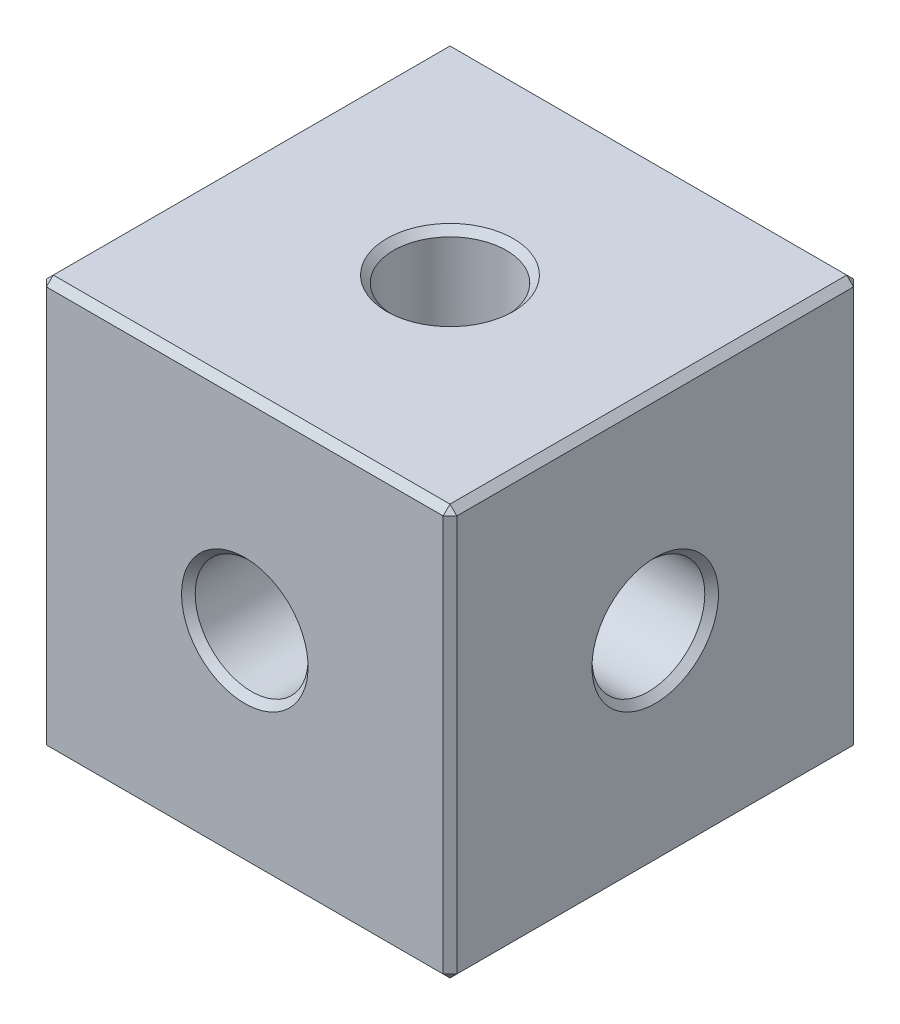
ISO-10303-21;
HEADER;
FILE_DESCRIPTION(('STEP AP214'),'2;1');
FILE_NAME('part.step','',(''),(''),'','','');
FILE_SCHEMA(('AUTOMOTIVE_DESIGN { 1 0 10303 214 1 1 1 1 }'));
ENDSEC;
DATA;
#1=APPLICATION_CONTEXT('core data for automotive mechanical design processes');
#2=APPLICATION_PROTOCOL_DEFINITION('international standard','automotive_design',2000,#1);
#3=PRODUCT_CONTEXT('',#1,'mechanical');
#4=PRODUCT('Part','Part','',(#3));
#5=PRODUCT_RELATED_PRODUCT_CATEGORY('part','',(#4));
#6=PRODUCT_DEFINITION_FORMATION('','',#4);
#7=PRODUCT_DEFINITION_CONTEXT('part definition',#1,'design');
#8=PRODUCT_DEFINITION('design','',#6,#7);
#9=PRODUCT_DEFINITION_SHAPE('','',#8);
#10=(LENGTH_UNIT() NAMED_UNIT(*) SI_UNIT(.MILLI.,.METRE.));
#11=(NAMED_UNIT(*) PLANE_ANGLE_UNIT() SI_UNIT($,.RADIAN.));
#12=(NAMED_UNIT(*) SI_UNIT($,.STERADIAN.) SOLID_ANGLE_UNIT());
#13=UNCERTAINTY_MEASURE_WITH_UNIT(LENGTH_MEASURE(1.E-05),#10,'distance_accuracy_value','');
#14=(GEOMETRIC_REPRESENTATION_CONTEXT(3) GLOBAL_UNCERTAINTY_ASSIGNED_CONTEXT((#13)) GLOBAL_UNIT_ASSIGNED_CONTEXT((#10,
#11,#12)) REPRESENTATION_CONTEXT('',''));
#15=CARTESIAN_POINT('',(0.,0.,0.));
#16=DIRECTION('',(0.,0.,1.));
#17=DIRECTION('',(1.,0.,0.));
#18=AXIS2_PLACEMENT_3D('',#15,#16,#17);
#19=CARTESIAN_POINT('',(0.,0.,6.));
#20=DIRECTION('',(0.,0.,1.));
#21=DIRECTION('',(1.,0.,0.));
#22=AXIS2_PLACEMENT_3D('',#19,#20,#21);
#23=CYLINDRICAL_SURFACE('',#22,1.65);
#24=CARTESIAN_POINT('',(0.,0.,5.8));
#25=DIRECTION('',(0.,0.,-1.));
#26=DIRECTION('',(-1.,0.,0.));
#27=AXIS2_PLACEMENT_3D('',#24,#25,#26);
#28=CIRCLE('',#27,1.65);
#29=CARTESIAN_POINT('',(-1.65,0.,5.8));
#30=VERTEX_POINT('',#29);
#31=EDGE_CURVE('E249',#30,#30,#28,.F.);
#32=ORIENTED_EDGE('',*,*,#31,.T.);
#33=EDGE_LOOP('',(#32));
#34=FACE_BOUND('',#33,.T.);
#35=CARTESIAN_POINT('',(0.,0.,0.));
#36=DIRECTION('',(0.,0.707106781186547,0.707106781186547));
#37=DIRECTION('',(0.,-0.707106781186547,0.707106781186547));
#38=AXIS2_PLACEMENT_3D('',#35,#36,#37);
#39=ELLIPSE('',#38,2.3334523779156,1.65);
#40=CARTESIAN_POINT('',(1.1667261889578,-1.1667261889578,1.1667261889578));
#41=VERTEX_POINT('',#40);
#42=CARTESIAN_POINT('',(-1.1667261889578,-1.1667261889578,1.1667261889578));
#43=VERTEX_POINT('',#42);
#44=EDGE_CURVE('E167',#41,#43,#39,.F.);
#45=ORIENTED_EDGE('',*,*,#44,.T.);
#46=CARTESIAN_POINT('',(0.,0.,0.));
#47=DIRECTION('',(0.707106781186548,0.,0.707106781186547));
#48=DIRECTION('',(-0.707106781186547,0.,0.707106781186547));
#49=AXIS2_PLACEMENT_3D('',#46,#47,#48);
#50=ELLIPSE('',#49,2.3334523779156,1.65);
#51=CARTESIAN_POINT('',(-1.1667261889578,1.1667261889578,1.1667261889578));
#52=VERTEX_POINT('',#51);
#53=EDGE_CURVE('E885',#43,#52,#50,.F.);
#54=ORIENTED_EDGE('',*,*,#53,.T.);
#55=CARTESIAN_POINT('',(0.,0.,0.));
#56=DIRECTION('',(0.,-0.707106781186547,0.707106781186547));
#57=DIRECTION('',(0.,0.707106781186547,0.707106781186547));
#58=AXIS2_PLACEMENT_3D('',#55,#56,#57);
#59=ELLIPSE('',#58,2.3334523779156,1.65);
#60=CARTESIAN_POINT('',(1.1667261889578,1.1667261889578,1.1667261889578));
#61=VERTEX_POINT('',#60);
#62=EDGE_CURVE('E184',#52,#61,#59,.F.);
#63=ORIENTED_EDGE('',*,*,#62,.T.);
#64=CARTESIAN_POINT('',(0.,0.,0.));
#65=DIRECTION('',(-0.707106781186547,0.,0.707106781186547));
#66=DIRECTION('',(0.707106781186548,0.,0.707106781186547));
#67=AXIS2_PLACEMENT_3D('',#64,#65,#66);
#68=ELLIPSE('',#67,2.3334523779156,1.65);
#69=EDGE_CURVE('E161',#61,#41,#68,.F.);
#70=ORIENTED_EDGE('',*,*,#69,.T.);
#71=EDGE_LOOP('',(#45,#54,#63,#70));
#72=FACE_BOUND('',#71,.T.);
#73=ADVANCED_FACE('F41',(#34,#72),#23,.F.);
#74=CARTESIAN_POINT('',(6.,6.,-6.));
#75=DIRECTION('',(-1.,0.,0.));
#76=DIRECTION('',(0.,0.,1.));
#77=AXIS2_PLACEMENT_3D('',#74,#75,#76);
#78=PLANE('',#77);
#79=CARTESIAN_POINT('',(6.,0.,0.));
#80=DIRECTION('',(-1.,0.,0.));
#81=DIRECTION('',(0.,0.,1.));
#82=AXIS2_PLACEMENT_3D('',#79,#80,#81);
#83=CIRCLE('',#82,1.85);
#84=CARTESIAN_POINT('',(6.,0.,1.85));
#85=VERTEX_POINT('',#84);
#86=EDGE_CURVE('E246',#85,#85,#83,.T.);
#87=ORIENTED_EDGE('',*,*,#86,.T.);
#88=EDGE_LOOP('',(#87));
#89=FACE_BOUND('',#88,.T.);
#90=DIRECTION('',(0.,0.,-1.));
#91=VECTOR('',#90,1.);
#92=CARTESIAN_POINT('',(6.,-5.8,-6.));
#93=LINE('',#92,#91);
#94=CARTESIAN_POINT('',(6.,-5.8,5.8));
#95=VERTEX_POINT('',#94);
#96=CARTESIAN_POINT('',(6.,-5.8,-5.8));
#97=VERTEX_POINT('',#96);
#98=EDGE_CURVE('E241',#95,#97,#93,.T.);
#99=ORIENTED_EDGE('',*,*,#98,.T.);
#100=DIRECTION('',(0.,1.,0.));
#101=VECTOR('',#100,1.);
#102=CARTESIAN_POINT('',(6.,6.,-5.8));
#103=LINE('',#102,#101);
#104=CARTESIAN_POINT('',(6.,5.8,-5.8));
#105=VERTEX_POINT('',#104);
#106=EDGE_CURVE('E243',#97,#105,#103,.T.);
#107=ORIENTED_EDGE('',*,*,#106,.T.);
#108=DIRECTION('',(0.,0.,1.));
#109=VECTOR('',#108,1.);
#110=CARTESIAN_POINT('',(6.,5.8,6.));
#111=LINE('',#110,#109);
#112=CARTESIAN_POINT('',(6.,5.8,5.8));
#113=VERTEX_POINT('',#112);
#114=EDGE_CURVE('E237',#105,#113,#111,.T.);
#115=ORIENTED_EDGE('',*,*,#114,.T.);
#116=DIRECTION('',(0.,-1.,0.));
#117=VECTOR('',#116,1.);
#118=CARTESIAN_POINT('',(6.,6.,5.8));
#119=LINE('',#118,#117);
#120=EDGE_CURVE('E239',#113,#95,#119,.T.);
#121=ORIENTED_EDGE('',*,*,#120,.T.);
#122=EDGE_LOOP('',(#99,#107,#115,#121));
#123=FACE_BOUND('',#122,.T.);
#124=ADVANCED_FACE('F350',(#89,#123),#78,.F.);
#125=CARTESIAN_POINT('',(-6.,6.,-6.));
#126=DIRECTION('',(0.,0.,1.));
#127=DIRECTION('',(1.,0.,0.));
#128=AXIS2_PLACEMENT_3D('',#125,#126,#127);
#129=PLANE('',#128);
#130=CARTESIAN_POINT('',(0.,0.,-6.));
#131=DIRECTION('',(0.,0.,1.));
#132=DIRECTION('',(1.,0.,0.));
#133=AXIS2_PLACEMENT_3D('',#130,#131,#132);
#134=CIRCLE('',#133,1.85);
#135=CARTESIAN_POINT('',(1.85,0.,-6.));
#136=VERTEX_POINT('',#135);
#137=EDGE_CURVE('E228',#136,#136,#134,.T.);
#138=ORIENTED_EDGE('',*,*,#137,.T.);
#139=EDGE_LOOP('',(#138));
#140=FACE_BOUND('',#139,.T.);
#141=DIRECTION('',(-1.,0.,0.));
#142=VECTOR('',#141,1.);
#143=CARTESIAN_POINT('',(-6.,-5.8,-6.));
#144=LINE('',#143,#142);
#145=CARTESIAN_POINT('',(5.8,-5.8,-6.));
#146=VERTEX_POINT('',#145);
#147=CARTESIAN_POINT('',(-5.8,-5.8,-6.));
#148=VERTEX_POINT('',#147);
#149=EDGE_CURVE('E223',#146,#148,#144,.T.);
#150=ORIENTED_EDGE('',*,*,#149,.T.);
#151=DIRECTION('',(0.,1.,0.));
#152=VECTOR('',#151,1.);
#153=CARTESIAN_POINT('',(-5.8,6.,-6.));
#154=LINE('',#153,#152);
#155=CARTESIAN_POINT('',(-5.8,5.8,-6.));
#156=VERTEX_POINT('',#155);
#157=EDGE_CURVE('E225',#148,#156,#154,.T.);
#158=ORIENTED_EDGE('',*,*,#157,.T.);
#159=DIRECTION('',(1.,0.,0.));
#160=VECTOR('',#159,1.);
#161=CARTESIAN_POINT('',(6.,5.8,-6.));
#162=LINE('',#161,#160);
#163=CARTESIAN_POINT('',(5.8,5.8,-6.));
#164=VERTEX_POINT('',#163);
#165=EDGE_CURVE('E219',#156,#164,#162,.T.);
#166=ORIENTED_EDGE('',*,*,#165,.T.);
#167=DIRECTION('',(0.,-1.,0.));
#168=VECTOR('',#167,1.);
#169=CARTESIAN_POINT('',(5.8,6.,-6.));
#170=LINE('',#169,#168);
#171=EDGE_CURVE('E221',#164,#146,#170,.T.);
#172=ORIENTED_EDGE('',*,*,#171,.T.);
#173=EDGE_LOOP('',(#150,#158,#166,#172));
#174=FACE_BOUND('',#173,.T.);
#175=ADVANCED_FACE('F371',(#140,#174),#129,.F.);
#176=CARTESIAN_POINT('',(-6.,6.,-6.));
#177=DIRECTION('',(1.,0.,0.));
#178=DIRECTION('',(0.,0.,-1.));
#179=AXIS2_PLACEMENT_3D('',#176,#177,#178);
#180=PLANE('',#179);
#181=CARTESIAN_POINT('',(-6.,0.,0.));
#182=DIRECTION('',(1.,0.,0.));
#183=DIRECTION('',(0.,0.,-1.));
#184=AXIS2_PLACEMENT_3D('',#181,#182,#183);
#185=CIRCLE('',#184,1.85);
#186=CARTESIAN_POINT('',(-6.,0.,-1.85));
#187=VERTEX_POINT('',#186);
#188=EDGE_CURVE('E213',#187,#187,#185,.T.);
#189=ORIENTED_EDGE('',*,*,#188,.T.);
#190=EDGE_LOOP('',(#189));
#191=FACE_BOUND('',#190,.T.);
#192=DIRECTION('',(0.,-1.,0.));
#193=VECTOR('',#192,1.);
#194=CARTESIAN_POINT('',(-6.,6.,-5.8));
#195=LINE('',#194,#193);
#196=CARTESIAN_POINT('',(-6.,5.8,-5.8));
#197=VERTEX_POINT('',#196);
#198=CARTESIAN_POINT('',(-6.,-5.8,-5.8));
#199=VERTEX_POINT('',#198);
#200=EDGE_CURVE('E208',#197,#199,#195,.T.);
#201=ORIENTED_EDGE('',*,*,#200,.T.);
#202=DIRECTION('',(0.,0.,1.));
#203=VECTOR('',#202,1.);
#204=CARTESIAN_POINT('',(-6.,-5.8,-6.));
#205=LINE('',#204,#203);
#206=CARTESIAN_POINT('',(-6.,-5.8,5.8));
#207=VERTEX_POINT('',#206);
#208=EDGE_CURVE('E210',#199,#207,#205,.T.);
#209=ORIENTED_EDGE('',*,*,#208,.T.);
#210=DIRECTION('',(0.,1.,0.));
#211=VECTOR('',#210,1.);
#212=CARTESIAN_POINT('',(-6.,6.,5.8));
#213=LINE('',#212,#211);
#214=CARTESIAN_POINT('',(-6.,5.8,5.8));
#215=VERTEX_POINT('',#214);
#216=EDGE_CURVE('E206',#207,#215,#213,.T.);
#217=ORIENTED_EDGE('',*,*,#216,.T.);
#218=DIRECTION('',(0.,0.,-1.));
#219=VECTOR('',#218,1.);
#220=CARTESIAN_POINT('',(-6.,5.8,-6.));
#221=LINE('',#220,#219);
#222=EDGE_CURVE('E204',#215,#197,#221,.T.);
#223=ORIENTED_EDGE('',*,*,#222,.T.);
#224=EDGE_LOOP('',(#201,#209,#217,#223));
#225=FACE_BOUND('',#224,.T.);
#226=ADVANCED_FACE('F432',(#191,#225),#180,.F.);
#227=CARTESIAN_POINT('',(-6.,6.,6.));
#228=DIRECTION('',(0.,0.,-1.));
#229=DIRECTION('',(-1.,0.,0.));
#230=AXIS2_PLACEMENT_3D('',#227,#228,#229);
#231=PLANE('',#230);
#232=CARTESIAN_POINT('',(0.,0.,6.));
#233=DIRECTION('',(0.,0.,-1.));
#234=DIRECTION('',(-1.,0.,0.));
#235=AXIS2_PLACEMENT_3D('',#232,#233,#234);
#236=CIRCLE('',#235,1.85);
#237=CARTESIAN_POINT('',(-1.85,0.,6.));
#238=VERTEX_POINT('',#237);
#239=EDGE_CURVE('E261',#238,#238,#236,.T.);
#240=ORIENTED_EDGE('',*,*,#239,.T.);
#241=EDGE_LOOP('',(#240));
#242=FACE_BOUND('',#241,.T.);
#243=DIRECTION('',(-1.,0.,0.));
#244=VECTOR('',#243,1.);
#245=CARTESIAN_POINT('',(-6.,5.8,6.));
#246=LINE('',#245,#244);
#247=CARTESIAN_POINT('',(5.8,5.8,6.));
#248=VERTEX_POINT('',#247);
#249=CARTESIAN_POINT('',(-5.8,5.8,6.));
#250=VERTEX_POINT('',#249);
#251=EDGE_CURVE('E252',#248,#250,#246,.T.);
#252=ORIENTED_EDGE('',*,*,#251,.T.);
#253=DIRECTION('',(0.,-1.,0.));
#254=VECTOR('',#253,1.);
#255=CARTESIAN_POINT('',(-5.8,6.,6.));
#256=LINE('',#255,#254);
#257=CARTESIAN_POINT('',(-5.8,-5.8,6.));
#258=VERTEX_POINT('',#257);
#259=EDGE_CURVE('E258',#250,#258,#256,.T.);
#260=ORIENTED_EDGE('',*,*,#259,.T.);
#261=DIRECTION('',(1.,0.,0.));
#262=VECTOR('',#261,1.);
#263=CARTESIAN_POINT('',(-6.,-5.8,6.));
#264=LINE('',#263,#262);
#265=CARTESIAN_POINT('',(5.8,-5.8,6.));
#266=VERTEX_POINT('',#265);
#267=EDGE_CURVE('E256',#258,#266,#264,.T.);
#268=ORIENTED_EDGE('',*,*,#267,.T.);
#269=DIRECTION('',(0.,1.,0.));
#270=VECTOR('',#269,1.);
#271=CARTESIAN_POINT('',(5.8,6.,6.));
#272=LINE('',#271,#270);
#273=EDGE_CURVE('E254',#266,#248,#272,.T.);
#274=ORIENTED_EDGE('',*,*,#273,.T.);
#275=EDGE_LOOP('',(#252,#260,#268,#274));
#276=FACE_BOUND('',#275,.T.);
#277=ADVANCED_FACE('F437',(#242,#276),#231,.F.);
#278=CARTESIAN_POINT('',(0.,6.,0.));
#279=DIRECTION('',(0.,1.,0.));
#280=DIRECTION('',(0.,0.,1.));
#281=AXIS2_PLACEMENT_3D('',#278,#279,#280);
#282=PLANE('',#281);
#283=DIRECTION('',(0.,0.,1.));
#284=VECTOR('',#283,1.);
#285=CARTESIAN_POINT('',(-5.8,6.,6.));
#286=LINE('',#285,#284);
#287=CARTESIAN_POINT('',(-5.8,6.,-5.8));
#288=VERTEX_POINT('',#287);
#289=CARTESIAN_POINT('',(-5.8,6.,5.8));
#290=VERTEX_POINT('',#289);
#291=EDGE_CURVE('E59',#288,#290,#286,.T.);
#292=ORIENTED_EDGE('',*,*,#291,.T.);
#293=DIRECTION('',(1.,0.,0.));
#294=VECTOR('',#293,1.);
#295=CARTESIAN_POINT('',(6.,6.,5.8));
#296=LINE('',#295,#294);
#297=CARTESIAN_POINT('',(5.8,6.,5.8));
#298=VERTEX_POINT('',#297);
#299=EDGE_CURVE('E51',#290,#298,#296,.T.);
#300=ORIENTED_EDGE('',*,*,#299,.T.);
#301=DIRECTION('',(0.,0.,-1.));
#302=VECTOR('',#301,1.);
#303=CARTESIAN_POINT('',(5.8,6.,-6.));
#304=LINE('',#303,#302);
#305=CARTESIAN_POINT('',(5.8,6.,-5.8));
#306=VERTEX_POINT('',#305);
#307=EDGE_CURVE('E267',#298,#306,#304,.T.);
#308=ORIENTED_EDGE('',*,*,#307,.T.);
#309=DIRECTION('',(-1.,0.,0.));
#310=VECTOR('',#309,1.);
#311=CARTESIAN_POINT('',(-6.,6.,-5.8));
#312=LINE('',#311,#310);
#313=EDGE_CURVE('E64',#306,#288,#312,.T.);
#314=ORIENTED_EDGE('',*,*,#313,.T.);
#315=EDGE_LOOP('',(#292,#300,#308,#314));
#316=FACE_BOUND('',#315,.T.);
#317=CARTESIAN_POINT('',(0.,6.,0.));
#318=DIRECTION('',(0.,1.,0.));
#319=DIRECTION('',(0.,0.,1.));
#320=AXIS2_PLACEMENT_3D('',#317,#318,#319);
#321=CIRCLE('',#320,1.85);
#322=CARTESIAN_POINT('',(0.,6.,1.85));
#323=VERTEX_POINT('',#322);
#324=EDGE_CURVE('E264',#323,#323,#321,.F.);
#325=ORIENTED_EDGE('',*,*,#324,.T.);
#326=EDGE_LOOP('',(#325));
#327=FACE_BOUND('',#326,.T.);
#328=ADVANCED_FACE('F418',(#316,#327),#282,.T.);
#329=CARTESIAN_POINT('',(0.,-6.,0.));
#330=DIRECTION('',(0.,1.,0.));
#331=DIRECTION('',(0.,0.,1.));
#332=AXIS2_PLACEMENT_3D('',#329,#330,#331);
#333=PLANE('',#332);
#334=CARTESIAN_POINT('',(0.,-6.,0.));
#335=DIRECTION('',(0.,1.,0.));
#336=DIRECTION('',(0.,0.,1.));
#337=AXIS2_PLACEMENT_3D('',#334,#335,#336);
#338=CIRCLE('',#337,1.85);
#339=CARTESIAN_POINT('',(0.,-6.,1.85));
#340=VERTEX_POINT('',#339);
#341=EDGE_CURVE('E198',#340,#340,#338,.T.);
#342=ORIENTED_EDGE('',*,*,#341,.T.);
#343=EDGE_LOOP('',(#342));
#344=FACE_BOUND('',#343,.T.);
#345=DIRECTION('',(-1.,0.,0.));
#346=VECTOR('',#345,1.);
#347=CARTESIAN_POINT('',(0.,-6.,5.8));
#348=LINE('',#347,#346);
#349=CARTESIAN_POINT('',(5.8,-6.,5.8));
#350=VERTEX_POINT('',#349);
#351=CARTESIAN_POINT('',(-5.8,-6.,5.8));
#352=VERTEX_POINT('',#351);
#353=EDGE_CURVE('E189',#350,#352,#348,.T.);
#354=ORIENTED_EDGE('',*,*,#353,.T.);
#355=DIRECTION('',(0.,0.,-1.));
#356=VECTOR('',#355,1.);
#357=CARTESIAN_POINT('',(-5.8,-6.,0.));
#358=LINE('',#357,#356);
#359=CARTESIAN_POINT('',(-5.8,-6.,-5.8));
#360=VERTEX_POINT('',#359);
#361=EDGE_CURVE('E195',#352,#360,#358,.T.);
#362=ORIENTED_EDGE('',*,*,#361,.T.);
#363=DIRECTION('',(1.,0.,0.));
#364=VECTOR('',#363,1.);
#365=CARTESIAN_POINT('',(0.,-6.,-5.8));
#366=LINE('',#365,#364);
#367=CARTESIAN_POINT('',(5.8,-6.,-5.8));
#368=VERTEX_POINT('',#367);
#369=EDGE_CURVE('E193',#360,#368,#366,.T.);
#370=ORIENTED_EDGE('',*,*,#369,.T.);
#371=DIRECTION('',(0.,0.,1.));
#372=VECTOR('',#371,1.);
#373=CARTESIAN_POINT('',(5.8,-6.,0.));
#374=LINE('',#373,#372);
#375=EDGE_CURVE('E191',#368,#350,#374,.T.);
#376=ORIENTED_EDGE('',*,*,#375,.T.);
#377=EDGE_LOOP('',(#354,#362,#370,#376));
#378=FACE_BOUND('',#377,.T.);
#379=ADVANCED_FACE('F410',(#344,#378),#333,.F.);
#380=CARTESIAN_POINT('',(0.,0.,-5.8));
#381=DIRECTION('',(0.,0.,1.));
#382=DIRECTION('',(1.,0.,0.));
#383=AXIS2_PLACEMENT_3D('',#380,#381,#382);
#384=CIRCLE('',#383,1.65);
#385=CARTESIAN_POINT('',(1.65,0.,-5.8));
#386=VERTEX_POINT('',#385);
#387=EDGE_CURVE('E231',#386,#386,#384,.F.);
#388=ORIENTED_EDGE('',*,*,#387,.T.);
#389=EDGE_LOOP('',(#388));
#390=FACE_BOUND('',#389,.T.);
#391=CARTESIAN_POINT('',(0.,0.,0.));
#392=DIRECTION('',(0.,-0.707106781186547,0.707106781186547));
#393=DIRECTION('',(0.,0.707106781186547,0.707106781186547));
#394=AXIS2_PLACEMENT_3D('',#391,#392,#393);
#395=ELLIPSE('',#394,2.3334523779156,1.65);
#396=CARTESIAN_POINT('',(-1.1667261889578,-1.1667261889578,-1.1667261889578));
#397=VERTEX_POINT('',#396);
#398=CARTESIAN_POINT('',(1.1667261889578,-1.1667261889578,-1.1667261889578));
#399=VERTEX_POINT('',#398);
#400=EDGE_CURVE('E176',#397,#399,#395,.T.);
#401=ORIENTED_EDGE('',*,*,#400,.T.);
#402=CARTESIAN_POINT('',(0.,0.,0.));
#403=DIRECTION('',(0.707106781186548,0.,0.707106781186547));
#404=DIRECTION('',(-0.707106781186547,0.,0.707106781186547));
#405=AXIS2_PLACEMENT_3D('',#402,#403,#404);
#406=ELLIPSE('',#405,2.3334523779156,1.65);
#407=CARTESIAN_POINT('',(1.1667261889578,1.1667261889578,-1.1667261889578));
#408=VERTEX_POINT('',#407);
#409=EDGE_CURVE('E158',#399,#408,#406,.T.);
#410=ORIENTED_EDGE('',*,*,#409,.T.);
#411=CARTESIAN_POINT('',(0.,0.,0.));
#412=DIRECTION('',(0.,0.707106781186547,0.707106781186547));
#413=DIRECTION('',(0.,-0.707106781186547,0.707106781186547));
#414=AXIS2_PLACEMENT_3D('',#411,#412,#413);
#415=ELLIPSE('',#414,2.3334523779156,1.65);
#416=CARTESIAN_POINT('',(-1.1667261889578,1.1667261889578,-1.1667261889578));
#417=VERTEX_POINT('',#416);
#418=EDGE_CURVE('E174',#408,#417,#415,.T.);
#419=ORIENTED_EDGE('',*,*,#418,.T.);
#420=CARTESIAN_POINT('',(0.,0.,0.));
#421=DIRECTION('',(-0.707106781186547,0.,0.707106781186547));
#422=DIRECTION('',(0.707106781186548,0.,0.707106781186547));
#423=AXIS2_PLACEMENT_3D('',#420,#421,#422);
#424=ELLIPSE('',#423,2.3334523779156,1.65);
#425=EDGE_CURVE('E886',#417,#397,#424,.T.);
#426=ORIENTED_EDGE('',*,*,#425,.T.);
#427=EDGE_LOOP('',(#401,#410,#419,#426));
#428=FACE_BOUND('',#427,.T.);
#429=ADVANCED_FACE('F172',(#390,#428),#23,.F.);
#430=CARTESIAN_POINT('',(0.,6.,0.));
#431=DIRECTION('',(0.,1.,0.));
#432=DIRECTION('',(0.,0.,1.));
#433=AXIS2_PLACEMENT_3D('',#430,#431,#432);
#434=CYLINDRICAL_SURFACE('',#433,1.65);
#435=CARTESIAN_POINT('',(0.,5.8,0.));
#436=DIRECTION('',(0.,1.,0.));
#437=DIRECTION('',(0.,0.,1.));
#438=AXIS2_PLACEMENT_3D('',#435,#436,#437);
#439=CIRCLE('',#438,1.65);
#440=CARTESIAN_POINT('',(0.,5.8,1.65));
#441=VERTEX_POINT('',#440);
#442=EDGE_CURVE('E11',#441,#441,#439,.T.);
#443=ORIENTED_EDGE('',*,*,#442,.T.);
#444=EDGE_LOOP('',(#443));
#445=FACE_BOUND('',#444,.T.);
#446=ORIENTED_EDGE('',*,*,#62,.F.);
#447=CARTESIAN_POINT('',(0.,0.,0.));
#448=DIRECTION('',(0.707106781186547,0.707106781186547,0.));
#449=DIRECTION('',(-0.707106781186547,0.707106781186547,0.));
#450=AXIS2_PLACEMENT_3D('',#447,#448,#449);
#451=ELLIPSE('',#450,2.3334523779156,1.65);
#452=EDGE_CURVE('E166',#52,#417,#451,.F.);
#453=ORIENTED_EDGE('',*,*,#452,.T.);
#454=ORIENTED_EDGE('',*,*,#418,.F.);
#455=CARTESIAN_POINT('',(0.,0.,0.));
#456=DIRECTION('',(-0.707106781186547,0.707106781186547,0.));
#457=DIRECTION('',(0.707106781186547,0.707106781186547,0.));
#458=AXIS2_PLACEMENT_3D('',#455,#456,#457);
#459=ELLIPSE('',#458,2.3334523779156,1.65);
#460=EDGE_CURVE('E155',#408,#61,#459,.F.);
#461=ORIENTED_EDGE('',*,*,#460,.T.);
#462=EDGE_LOOP('',(#446,#453,#454,#461));
#463=FACE_BOUND('',#462,.T.);
#464=ADVANCED_FACE('F180',(#445,#463),#434,.F.);
#465=CARTESIAN_POINT('',(0.,-5.8,0.));
#466=DIRECTION('',(0.,1.,0.));
#467=DIRECTION('',(0.,0.,1.));
#468=AXIS2_PLACEMENT_3D('',#465,#466,#467);
#469=CIRCLE('',#468,1.65);
#470=CARTESIAN_POINT('',(0.,-5.8,1.65));
#471=VERTEX_POINT('',#470);
#472=EDGE_CURVE('E201',#471,#471,#469,.F.);
#473=ORIENTED_EDGE('',*,*,#472,.T.);
#474=EDGE_LOOP('',(#473));
#475=FACE_BOUND('',#474,.T.);
#476=ORIENTED_EDGE('',*,*,#44,.F.);
#477=CARTESIAN_POINT('',(0.,0.,0.));
#478=DIRECTION('',(0.707106781186547,0.707106781186547,0.));
#479=DIRECTION('',(-0.707106781186547,0.707106781186547,0.));
#480=AXIS2_PLACEMENT_3D('',#477,#478,#479);
#481=ELLIPSE('',#480,2.3334523779156,1.65);
#482=EDGE_CURVE('E177',#41,#399,#481,.T.);
#483=ORIENTED_EDGE('',*,*,#482,.T.);
#484=ORIENTED_EDGE('',*,*,#400,.F.);
#485=CARTESIAN_POINT('',(0.,0.,0.));
#486=DIRECTION('',(-0.707106781186547,0.707106781186547,0.));
#487=DIRECTION('',(0.707106781186547,0.707106781186547,0.));
#488=AXIS2_PLACEMENT_3D('',#485,#486,#487);
#489=ELLIPSE('',#488,2.3334523779156,1.65);
#490=EDGE_CURVE('E883',#397,#43,#489,.T.);
#491=ORIENTED_EDGE('',*,*,#490,.T.);
#492=EDGE_LOOP('',(#476,#483,#484,#491));
#493=FACE_BOUND('',#492,.T.);
#494=ADVANCED_FACE('F416',(#475,#493),#434,.F.);
#495=CARTESIAN_POINT('',(6.,0.,0.));
#496=DIRECTION('',(1.,0.,0.));
#497=DIRECTION('',(0.,0.,-1.));
#498=AXIS2_PLACEMENT_3D('',#495,#496,#497);
#499=CYLINDRICAL_SURFACE('',#498,1.65);
#500=CARTESIAN_POINT('',(5.8,0.,0.));
#501=DIRECTION('',(-1.,0.,0.));
#502=DIRECTION('',(0.,0.,1.));
#503=AXIS2_PLACEMENT_3D('',#500,#501,#502);
#504=CIRCLE('',#503,1.65);
#505=CARTESIAN_POINT('',(5.8,0.,1.65));
#506=VERTEX_POINT('',#505);
#507=EDGE_CURVE('E234',#506,#506,#504,.F.);
#508=ORIENTED_EDGE('',*,*,#507,.T.);
#509=EDGE_LOOP('',(#508));
#510=FACE_BOUND('',#509,.T.);
#511=ORIENTED_EDGE('',*,*,#460,.F.);
#512=ORIENTED_EDGE('',*,*,#409,.F.);
#513=ORIENTED_EDGE('',*,*,#482,.F.);
#514=ORIENTED_EDGE('',*,*,#69,.F.);
#515=EDGE_LOOP('',(#511,#512,#513,#514));
#516=FACE_BOUND('',#515,.T.);
#517=ADVANCED_FACE('F157',(#510,#516),#499,.F.);
#518=CARTESIAN_POINT('',(-5.8,0.,0.));
#519=DIRECTION('',(1.,0.,0.));
#520=DIRECTION('',(0.,0.,-1.));
#521=AXIS2_PLACEMENT_3D('',#518,#519,#520);
#522=CIRCLE('',#521,1.65);
#523=CARTESIAN_POINT('',(-5.8,0.,-1.65));
#524=VERTEX_POINT('',#523);
#525=EDGE_CURVE('E216',#524,#524,#522,.F.);
#526=ORIENTED_EDGE('',*,*,#525,.T.);
#527=EDGE_LOOP('',(#526));
#528=FACE_BOUND('',#527,.T.);
#529=ORIENTED_EDGE('',*,*,#490,.F.);
#530=ORIENTED_EDGE('',*,*,#425,.F.);
#531=ORIENTED_EDGE('',*,*,#452,.F.);
#532=ORIENTED_EDGE('',*,*,#53,.F.);
#533=EDGE_LOOP('',(#529,#530,#531,#532));
#534=FACE_BOUND('',#533,.T.);
#535=ADVANCED_FACE('F449',(#528,#534),#499,.F.);
#536=CARTESIAN_POINT('',(0.,-6.,0.));
#537=DIRECTION('',(0.,-1.,0.));
#538=DIRECTION('',(0.,0.,-1.));
#539=AXIS2_PLACEMENT_3D('',#536,#537,#538);
#540=CONICAL_SURFACE('',#539,1.85,0.785398163397446);
#541=ORIENTED_EDGE('',*,*,#472,.F.);
#542=EDGE_LOOP('',(#541));
#543=FACE_BOUND('',#542,.T.);
#544=ORIENTED_EDGE('',*,*,#341,.F.);
#545=EDGE_LOOP('',(#544));
#546=FACE_BOUND('',#545,.T.);
#547=ADVANCED_FACE('F443',(#543,#546),#540,.F.);
#548=CARTESIAN_POINT('',(-6.,0.,0.));
#549=DIRECTION('',(-1.,0.,0.));
#550=DIRECTION('',(0.,0.,1.));
#551=AXIS2_PLACEMENT_3D('',#548,#549,#550);
#552=CONICAL_SURFACE('',#551,1.85,0.785398163397446);
#553=ORIENTED_EDGE('',*,*,#525,.F.);
#554=EDGE_LOOP('',(#553));
#555=FACE_BOUND('',#554,.T.);
#556=ORIENTED_EDGE('',*,*,#188,.F.);
#557=EDGE_LOOP('',(#556));
#558=FACE_BOUND('',#557,.T.);
#559=ADVANCED_FACE('F427',(#555,#558),#552,.F.);
#560=CARTESIAN_POINT('',(0.,0.,-6.));
#561=DIRECTION('',(0.,0.,-1.));
#562=DIRECTION('',(-1.,0.,0.));
#563=AXIS2_PLACEMENT_3D('',#560,#561,#562);
#564=CONICAL_SURFACE('',#563,1.85,0.785398163397446);
#565=ORIENTED_EDGE('',*,*,#387,.F.);
#566=EDGE_LOOP('',(#565));
#567=FACE_BOUND('',#566,.T.);
#568=ORIENTED_EDGE('',*,*,#137,.F.);
#569=EDGE_LOOP('',(#568));
#570=FACE_BOUND('',#569,.T.);
#571=ADVANCED_FACE('F423',(#567,#570),#564,.F.);
#572=CARTESIAN_POINT('',(5.8,0.,0.));
#573=DIRECTION('',(1.,0.,0.));
#574=DIRECTION('',(0.,0.,-1.));
#575=AXIS2_PLACEMENT_3D('',#572,#573,#574);
#576=CONICAL_SURFACE('',#575,1.65,0.785398163397456);
#577=ORIENTED_EDGE('',*,*,#86,.F.);
#578=EDGE_LOOP('',(#577));
#579=FACE_BOUND('',#578,.T.);
#580=ORIENTED_EDGE('',*,*,#507,.F.);
#581=EDGE_LOOP('',(#580));
#582=FACE_BOUND('',#581,.T.);
#583=ADVANCED_FACE('F426',(#579,#582),#576,.F.);
#584=CARTESIAN_POINT('',(0.,0.,5.8));
#585=DIRECTION('',(0.,0.,1.));
#586=DIRECTION('',(1.,0.,0.));
#587=AXIS2_PLACEMENT_3D('',#584,#585,#586);
#588=CONICAL_SURFACE('',#587,1.65,0.785398163397448);
#589=ORIENTED_EDGE('',*,*,#239,.F.);
#590=EDGE_LOOP('',(#589));
#591=FACE_BOUND('',#590,.T.);
#592=ORIENTED_EDGE('',*,*,#31,.F.);
#593=EDGE_LOOP('',(#592));
#594=FACE_BOUND('',#593,.T.);
#595=ADVANCED_FACE('F465',(#591,#594),#588,.F.);
#596=CARTESIAN_POINT('',(5.8,6.,0.));
#597=DIRECTION('',(0.707106781186551,0.707106781186544,0.));
#598=DIRECTION('',(0.,0.,1.));
#599=AXIS2_PLACEMENT_3D('',#596,#597,#598);
#600=PLANE('',#599);
#601=DIRECTION('',(0.707106781186544,-0.70710678118655,0.));
#602=VECTOR('',#601,1.);
#603=CARTESIAN_POINT('',(6.,5.8,-5.8));
#604=LINE('',#603,#602);
#605=EDGE_CURVE('E46',#306,#105,#604,.T.);
#606=ORIENTED_EDGE('',*,*,#605,.F.);
#607=ORIENTED_EDGE('',*,*,#307,.F.);
#608=DIRECTION('',(-0.707106781186544,0.707106781186551,0.));
#609=VECTOR('',#608,1.);
#610=CARTESIAN_POINT('',(5.9,5.9,5.8));
#611=LINE('',#610,#609);
#612=EDGE_CURVE('E331',#113,#298,#611,.T.);
#613=ORIENTED_EDGE('',*,*,#612,.F.);
#614=ORIENTED_EDGE('',*,*,#114,.F.);
#615=EDGE_LOOP('',(#606,#607,#613,#614));
#616=FACE_BOUND('',#615,.T.);
#617=ADVANCED_FACE('F347',(#616),#600,.T.);
#618=CARTESIAN_POINT('',(6.,5.8,-5.8));
#619=DIRECTION('',(0.577350269189631,0.577350269189621,-0.577350269189626));
#620=DIRECTION('',(-0.707106781186544,0.,-0.707106781186551));
#621=AXIS2_PLACEMENT_3D('',#618,#619,#620);
#622=PLANE('',#621);
#623=DIRECTION('',(0.,0.707106781186551,0.707106781186544));
#624=VECTOR('',#623,1.);
#625=CARTESIAN_POINT('',(5.8,5.9,-5.9));
#626=LINE('',#625,#624);
#627=EDGE_CURVE('E327',#306,#164,#626,.F.);
#628=ORIENTED_EDGE('',*,*,#627,.F.);
#629=ORIENTED_EDGE('',*,*,#605,.T.);
#630=DIRECTION('',(0.707106781186545,0.,0.707106781186551));
#631=VECTOR('',#630,1.);
#632=CARTESIAN_POINT('',(6.,5.8,-5.8));
#633=LINE('',#632,#631);
#634=EDGE_CURVE('E330',#164,#105,#633,.T.);
#635=ORIENTED_EDGE('',*,*,#634,.F.);
#636=EDGE_LOOP('',(#628,#629,#635));
#637=FACE_BOUND('',#636,.T.);
#638=ADVANCED_FACE('F344',(#637),#622,.T.);
#639=CARTESIAN_POINT('',(5.8,5.8,6.));
#640=DIRECTION('',(0.57735026918963,0.57735026918962,0.577350269189627));
#641=DIRECTION('',(0.707106781186546,0.,-0.707106781186549));
#642=AXIS2_PLACEMENT_3D('',#639,#640,#641);
#643=PLANE('',#642);
#644=DIRECTION('',(-0.707106781186546,0.,0.707106781186549));
#645=VECTOR('',#644,1.);
#646=CARTESIAN_POINT('',(5.8,5.8,6.));
#647=LINE('',#646,#645);
#648=EDGE_CURVE('E322',#113,#248,#647,.T.);
#649=ORIENTED_EDGE('',*,*,#648,.F.);
#650=ORIENTED_EDGE('',*,*,#612,.T.);
#651=DIRECTION('',(0.,-0.707106781186551,0.707106781186544));
#652=VECTOR('',#651,1.);
#653=CARTESIAN_POINT('',(5.8,5.8,6.));
#654=LINE('',#653,#652);
#655=EDGE_CURVE('E325',#248,#298,#654,.F.);
#656=ORIENTED_EDGE('',*,*,#655,.F.);
#657=EDGE_LOOP('',(#649,#650,#656));
#658=FACE_BOUND('',#657,.T.);
#659=ADVANCED_FACE('F395',(#658),#643,.T.);
#660=CARTESIAN_POINT('',(5.8,6.,-6.));
#661=DIRECTION('',(-0.707106781186551,0.,0.707106781186544));
#662=DIRECTION('',(0.,-1.,0.));
#663=AXIS2_PLACEMENT_3D('',#660,#661,#662);
#664=PLANE('',#663);
#665=ORIENTED_EDGE('',*,*,#634,.T.);
#666=ORIENTED_EDGE('',*,*,#106,.F.);
#667=DIRECTION('',(-0.707106781186544,0.,-0.707106781186551));
#668=VECTOR('',#667,1.);
#669=CARTESIAN_POINT('',(5.9,-5.8,-5.9));
#670=LINE('',#669,#668);
#671=EDGE_CURVE('E316',#146,#97,#670,.F.);
#672=ORIENTED_EDGE('',*,*,#671,.F.);
#673=ORIENTED_EDGE('',*,*,#171,.F.);
#674=EDGE_LOOP('',(#665,#666,#672,#673));
#675=FACE_BOUND('',#674,.T.);
#676=ADVANCED_FACE('F355',(#675),#664,.F.);
#677=CARTESIAN_POINT('',(0.,6.,-5.8));
#678=DIRECTION('',(0.,0.707106781186544,-0.707106781186551));
#679=DIRECTION('',(1.,0.,0.));
#680=AXIS2_PLACEMENT_3D('',#677,#678,#679);
#681=PLANE('',#680);
#682=ORIENTED_EDGE('',*,*,#627,.T.);
#683=ORIENTED_EDGE('',*,*,#165,.F.);
#684=DIRECTION('',(0.,-0.707106781186551,-0.707106781186544));
#685=VECTOR('',#684,1.);
#686=CARTESIAN_POINT('',(-5.8,5.8,-6.));
#687=LINE('',#686,#685);
#688=EDGE_CURVE('E313',#288,#156,#687,.T.);
#689=ORIENTED_EDGE('',*,*,#688,.F.);
#690=ORIENTED_EDGE('',*,*,#313,.F.);
#691=EDGE_LOOP('',(#682,#683,#689,#690));
#692=FACE_BOUND('',#691,.T.);
#693=ADVANCED_FACE('F384',(#692),#681,.T.);
#694=CARTESIAN_POINT('',(-5.8,6.,0.));
#695=DIRECTION('',(-0.70710678118655,0.707106781186545,0.));
#696=DIRECTION('',(0.,0.,-1.));
#697=AXIS2_PLACEMENT_3D('',#694,#695,#696);
#698=PLANE('',#697);
#699=DIRECTION('',(-0.707106781186545,-0.70710678118655,0.));
#700=VECTOR('',#699,1.);
#701=CARTESIAN_POINT('',(-6.,5.8,5.8));
#702=LINE('',#701,#700);
#703=EDGE_CURVE('E307',#290,#215,#702,.T.);
#704=ORIENTED_EDGE('',*,*,#703,.F.);
#705=ORIENTED_EDGE('',*,*,#291,.F.);
#706=DIRECTION('',(0.707106781186545,0.70710678118655,0.));
#707=VECTOR('',#706,1.);
#708=CARTESIAN_POINT('',(-5.9,5.9,-5.8));
#709=LINE('',#708,#707);
#710=EDGE_CURVE('E310',#197,#288,#709,.T.);
#711=ORIENTED_EDGE('',*,*,#710,.F.);
#712=ORIENTED_EDGE('',*,*,#222,.F.);
#713=EDGE_LOOP('',(#704,#705,#711,#712));
#714=FACE_BOUND('',#713,.T.);
#715=ADVANCED_FACE('F386',(#714),#698,.T.);
#716=CARTESIAN_POINT('',(0.,6.,5.8));
#717=DIRECTION('',(0.,0.707106781186544,0.707106781186551));
#718=DIRECTION('',(-1.,0.,0.));
#719=AXIS2_PLACEMENT_3D('',#716,#717,#718);
#720=PLANE('',#719);
#721=ORIENTED_EDGE('',*,*,#655,.T.);
#722=ORIENTED_EDGE('',*,*,#299,.F.);
#723=DIRECTION('',(0.,0.707106781186551,-0.707106781186544));
#724=VECTOR('',#723,1.);
#725=CARTESIAN_POINT('',(-5.8,5.9,5.9));
#726=LINE('',#725,#724);
#727=EDGE_CURVE('E304',#250,#290,#726,.T.);
#728=ORIENTED_EDGE('',*,*,#727,.F.);
#729=ORIENTED_EDGE('',*,*,#251,.F.);
#730=EDGE_LOOP('',(#721,#722,#728,#729));
#731=FACE_BOUND('',#730,.T.);
#732=ADVANCED_FACE('F392',(#731),#720,.T.);
#733=CARTESIAN_POINT('',(6.,6.,5.8));
#734=DIRECTION('',(-0.707106781186549,0.,-0.707106781186546));
#735=DIRECTION('',(0.,-1.,0.));
#736=AXIS2_PLACEMENT_3D('',#733,#734,#735);
#737=PLANE('',#736);
#738=ORIENTED_EDGE('',*,*,#648,.T.);
#739=ORIENTED_EDGE('',*,*,#273,.F.);
#740=DIRECTION('',(0.707106781186546,0.,-0.707106781186549));
#741=VECTOR('',#740,1.);
#742=CARTESIAN_POINT('',(5.9,-5.8,5.9));
#743=LINE('',#742,#741);
#744=EDGE_CURVE('E301',#95,#266,#743,.F.);
#745=ORIENTED_EDGE('',*,*,#744,.F.);
#746=ORIENTED_EDGE('',*,*,#120,.F.);
#747=EDGE_LOOP('',(#738,#739,#745,#746));
#748=FACE_BOUND('',#747,.T.);
#749=ADVANCED_FACE('F548',(#748),#737,.F.);
#750=CARTESIAN_POINT('',(6.,-5.8,-6.));
#751=DIRECTION('',(-0.707106781186551,0.707106781186544,0.));
#752=DIRECTION('',(0.,0.,-1.));
#753=AXIS2_PLACEMENT_3D('',#750,#751,#752);
#754=PLANE('',#753);
#755=DIRECTION('',(0.707106781186544,0.707106781186551,0.));
#756=VECTOR('',#755,1.);
#757=CARTESIAN_POINT('',(5.8,-6.,-5.8));
#758=LINE('',#757,#756);
#759=EDGE_CURVE('E319',#97,#368,#758,.F.);
#760=ORIENTED_EDGE('',*,*,#759,.F.);
#761=ORIENTED_EDGE('',*,*,#98,.F.);
#762=DIRECTION('',(-0.707106781186545,-0.707106781186551,0.));
#763=VECTOR('',#762,1.);
#764=CARTESIAN_POINT('',(5.8,-6.,5.8));
#765=LINE('',#764,#763);
#766=EDGE_CURVE('E298',#350,#95,#765,.F.);
#767=ORIENTED_EDGE('',*,*,#766,.F.);
#768=ORIENTED_EDGE('',*,*,#375,.F.);
#769=EDGE_LOOP('',(#760,#761,#767,#768));
#770=FACE_BOUND('',#769,.T.);
#771=ADVANCED_FACE('F359',(#770),#754,.F.);
#772=CARTESIAN_POINT('',(5.8,-6.,-5.8));
#773=DIRECTION('',(0.577350269189631,-0.577350269189626,-0.577350269189621));
#774=DIRECTION('',(0.707106781186544,0.70710678118655,0.));
#775=AXIS2_PLACEMENT_3D('',#772,#773,#774);
#776=PLANE('',#775);
#777=ORIENTED_EDGE('',*,*,#671,.T.);
#778=ORIENTED_EDGE('',*,*,#759,.T.);
#779=DIRECTION('',(0.,-0.707106781186544,0.707106781186551));
#780=VECTOR('',#779,1.);
#781=CARTESIAN_POINT('',(5.8,-6.,-5.8));
#782=LINE('',#781,#780);
#783=EDGE_CURVE('E295',#146,#368,#782,.T.);
#784=ORIENTED_EDGE('',*,*,#783,.F.);
#785=EDGE_LOOP('',(#777,#778,#784));
#786=FACE_BOUND('',#785,.T.);
#787=ADVANCED_FACE('F363',(#786),#776,.T.);
#788=CARTESIAN_POINT('',(-5.8,5.8,-6.));
#789=DIRECTION('',(-0.577350269189626,0.577350269189621,-0.577350269189631));
#790=DIRECTION('',(-0.707106781186551,0.,0.707106781186544));
#791=AXIS2_PLACEMENT_3D('',#788,#789,#790);
#792=PLANE('',#791);
#793=ORIENTED_EDGE('',*,*,#710,.T.);
#794=ORIENTED_EDGE('',*,*,#688,.T.);
#795=DIRECTION('',(0.707106781186551,0.,-0.707106781186545));
#796=VECTOR('',#795,1.);
#797=CARTESIAN_POINT('',(-5.8,5.8,-6.));
#798=LINE('',#797,#796);
#799=EDGE_CURVE('E293',#197,#156,#798,.T.);
#800=ORIENTED_EDGE('',*,*,#799,.F.);
#801=EDGE_LOOP('',(#793,#794,#800));
#802=FACE_BOUND('',#801,.T.);
#803=ADVANCED_FACE('F381',(#802),#792,.T.);
#804=CARTESIAN_POINT('',(-6.,5.8,5.8));
#805=DIRECTION('',(-0.577350269189631,0.577350269189621,0.577350269189626));
#806=DIRECTION('',(0.707106781186544,0.,0.707106781186551));
#807=AXIS2_PLACEMENT_3D('',#804,#805,#806);
#808=PLANE('',#807);
#809=ORIENTED_EDGE('',*,*,#727,.T.);
#810=ORIENTED_EDGE('',*,*,#703,.T.);
#811=DIRECTION('',(-0.707106781186545,0.,-0.707106781186551));
#812=VECTOR('',#811,1.);
#813=CARTESIAN_POINT('',(-6.,5.8,5.8));
#814=LINE('',#813,#812);
#815=EDGE_CURVE('E290',#250,#215,#814,.T.);
#816=ORIENTED_EDGE('',*,*,#815,.F.);
#817=EDGE_LOOP('',(#809,#810,#816));
#818=FACE_BOUND('',#817,.T.);
#819=ADVANCED_FACE('F525',(#818),#808,.T.);
#820=CARTESIAN_POINT('',(5.8,-6.,5.8));
#821=DIRECTION('',(0.57735026918963,-0.577350269189625,0.577350269189622));
#822=DIRECTION('',(0.707106781186545,0.707106781186551,0.));
#823=AXIS2_PLACEMENT_3D('',#820,#821,#822);
#824=PLANE('',#823);
#825=ORIENTED_EDGE('',*,*,#766,.T.);
#826=ORIENTED_EDGE('',*,*,#744,.T.);
#827=DIRECTION('',(0.,0.707106781186544,0.707106781186551));
#828=VECTOR('',#827,1.);
#829=CARTESIAN_POINT('',(5.8,-6.,5.8));
#830=LINE('',#829,#828);
#831=EDGE_CURVE('E287',#350,#266,#830,.T.);
#832=ORIENTED_EDGE('',*,*,#831,.F.);
#833=EDGE_LOOP('',(#825,#826,#832));
#834=FACE_BOUND('',#833,.T.);
#835=ADVANCED_FACE('F519',(#834),#824,.T.);
#836=CARTESIAN_POINT('',(-6.,-5.8,-6.));
#837=DIRECTION('',(0.,0.707106781186551,0.707106781186544));
#838=DIRECTION('',(-1.,0.,0.));
#839=AXIS2_PLACEMENT_3D('',#836,#837,#838);
#840=PLANE('',#839);
#841=ORIENTED_EDGE('',*,*,#783,.T.);
#842=ORIENTED_EDGE('',*,*,#369,.F.);
#843=DIRECTION('',(0.,0.707106781186545,-0.707106781186551));
#844=VECTOR('',#843,1.);
#845=CARTESIAN_POINT('',(-5.8,-6.,-5.8));
#846=LINE('',#845,#844);
#847=EDGE_CURVE('E284',#148,#360,#846,.F.);
#848=ORIENTED_EDGE('',*,*,#847,.F.);
#849=ORIENTED_EDGE('',*,*,#149,.F.);
#850=EDGE_LOOP('',(#841,#842,#848,#849));
#851=FACE_BOUND('',#850,.T.);
#852=ADVANCED_FACE('F368',(#851),#840,.F.);
#853=CARTESIAN_POINT('',(-6.,6.,-5.8));
#854=DIRECTION('',(0.707106781186544,0.,0.707106781186551));
#855=DIRECTION('',(0.,-1.,0.));
#856=AXIS2_PLACEMENT_3D('',#853,#854,#855);
#857=PLANE('',#856);
#858=ORIENTED_EDGE('',*,*,#799,.T.);
#859=ORIENTED_EDGE('',*,*,#157,.F.);
#860=DIRECTION('',(-0.707106781186551,0.,0.707106781186544));
#861=VECTOR('',#860,1.);
#862=CARTESIAN_POINT('',(-5.9,-5.8,-5.9));
#863=LINE('',#862,#861);
#864=EDGE_CURVE('E281',#199,#148,#863,.F.);
#865=ORIENTED_EDGE('',*,*,#864,.F.);
#866=ORIENTED_EDGE('',*,*,#200,.F.);
#867=EDGE_LOOP('',(#858,#859,#865,#866));
#868=FACE_BOUND('',#867,.T.);
#869=ADVANCED_FACE('F374',(#868),#857,.F.);
#870=CARTESIAN_POINT('',(-5.8,6.,6.));
#871=DIRECTION('',(0.707106781186551,0.,-0.707106781186544));
#872=DIRECTION('',(0.,-1.,0.));
#873=AXIS2_PLACEMENT_3D('',#870,#871,#872);
#874=PLANE('',#873);
#875=ORIENTED_EDGE('',*,*,#815,.T.);
#876=ORIENTED_EDGE('',*,*,#216,.F.);
#877=DIRECTION('',(0.707106781186544,0.,0.707106781186551));
#878=VECTOR('',#877,1.);
#879=CARTESIAN_POINT('',(-6.,-5.8,5.8));
#880=LINE('',#879,#878);
#881=EDGE_CURVE('E278',#258,#207,#880,.F.);
#882=ORIENTED_EDGE('',*,*,#881,.F.);
#883=ORIENTED_EDGE('',*,*,#259,.F.);
#884=EDGE_LOOP('',(#875,#876,#882,#883));
#885=FACE_BOUND('',#884,.T.);
#886=ADVANCED_FACE('F501',(#885),#874,.F.);
#887=CARTESIAN_POINT('',(-6.,-5.8,6.));
#888=DIRECTION('',(0.,0.707106781186551,-0.707106781186544));
#889=DIRECTION('',(1.,0.,0.));
#890=AXIS2_PLACEMENT_3D('',#887,#888,#889);
#891=PLANE('',#890);
#892=ORIENTED_EDGE('',*,*,#831,.T.);
#893=ORIENTED_EDGE('',*,*,#267,.F.);
#894=DIRECTION('',(0.,-0.707106781186544,-0.707106781186551));
#895=VECTOR('',#894,1.);
#896=CARTESIAN_POINT('',(-5.8,-5.9,5.9));
#897=LINE('',#896,#895);
#898=EDGE_CURVE('E276',#352,#258,#897,.F.);
#899=ORIENTED_EDGE('',*,*,#898,.F.);
#900=ORIENTED_EDGE('',*,*,#353,.F.);
#901=EDGE_LOOP('',(#892,#893,#899,#900));
#902=FACE_BOUND('',#901,.T.);
#903=ADVANCED_FACE('F494',(#902),#891,.F.);
#904=CARTESIAN_POINT('',(-5.8,-6.,-5.8));
#905=DIRECTION('',(-0.577350269189621,-0.577350269189631,-0.577350269189626));
#906=DIRECTION('',(0.,0.707106781186544,-0.707106781186551));
#907=AXIS2_PLACEMENT_3D('',#904,#905,#906);
#908=PLANE('',#907);
#909=ORIENTED_EDGE('',*,*,#864,.T.);
#910=ORIENTED_EDGE('',*,*,#847,.T.);
#911=DIRECTION('',(0.707106781186551,-0.707106781186544,0.));
#912=VECTOR('',#911,1.);
#913=CARTESIAN_POINT('',(-5.8,-6.,-5.8));
#914=LINE('',#913,#912);
#915=EDGE_CURVE('E274',#199,#360,#914,.T.);
#916=ORIENTED_EDGE('',*,*,#915,.F.);
#917=EDGE_LOOP('',(#909,#910,#916));
#918=FACE_BOUND('',#917,.T.);
#919=ADVANCED_FACE('F487',(#918),#908,.T.);
#920=CARTESIAN_POINT('',(-6.,-5.8,5.8));
#921=DIRECTION('',(-0.577350269189626,-0.577350269189631,0.577350269189621));
#922=DIRECTION('',(0.70710678118655,-0.707106781186544,0.));
#923=AXIS2_PLACEMENT_3D('',#920,#921,#922);
#924=PLANE('',#923);
#925=ORIENTED_EDGE('',*,*,#898,.T.);
#926=ORIENTED_EDGE('',*,*,#881,.T.);
#927=DIRECTION('',(-0.707106781186551,0.707106781186544,0.));
#928=VECTOR('',#927,1.);
#929=CARTESIAN_POINT('',(-6.,-5.8,5.8));
#930=LINE('',#929,#928);
#931=EDGE_CURVE('E272',#352,#207,#930,.T.);
#932=ORIENTED_EDGE('',*,*,#931,.F.);
#933=EDGE_LOOP('',(#925,#926,#932));
#934=FACE_BOUND('',#933,.T.);
#935=ADVANCED_FACE('F480',(#934),#924,.T.);
#936=CARTESIAN_POINT('',(-6.,-5.8,-6.));
#937=DIRECTION('',(0.707106781186544,0.707106781186551,0.));
#938=DIRECTION('',(0.,0.,1.));
#939=AXIS2_PLACEMENT_3D('',#936,#937,#938);
#940=PLANE('',#939);
#941=ORIENTED_EDGE('',*,*,#915,.T.);
#942=ORIENTED_EDGE('',*,*,#361,.F.);
#943=ORIENTED_EDGE('',*,*,#931,.T.);
#944=ORIENTED_EDGE('',*,*,#208,.F.);
#945=EDGE_LOOP('',(#941,#942,#943,#944));
#946=FACE_BOUND('',#945,.T.);
#947=ADVANCED_FACE('F474',(#946),#940,.F.);
#948=CARTESIAN_POINT('',(0.,5.8,0.));
#949=DIRECTION('',(0.,1.,0.));
#950=DIRECTION('',(0.,0.,1.));
#951=AXIS2_PLACEMENT_3D('',#948,#949,#950);
#952=CONICAL_SURFACE('',#951,1.65,0.785398163397448);
#953=ORIENTED_EDGE('',*,*,#324,.F.);
#954=EDGE_LOOP('',(#953));
#955=FACE_BOUND('',#954,.T.);
#956=ORIENTED_EDGE('',*,*,#442,.F.);
#957=EDGE_LOOP('',(#956));
#958=FACE_BOUND('',#957,.T.);
#959=ADVANCED_FACE('F44',(#955,#958),#952,.F.);
#960=CLOSED_SHELL('',(#73,#124,#175,#226,#277,#328,#379,#429,#464,#494,#517,#535,#547,#559,#571,
#583,#595,#617,#638,#659,#676,#693,#715,#732,#749,#771,#787,#803,#819,#835,#852,#869,#886,#903,
#919,#935,#947,#959));
#961=MANIFOLD_SOLID_BREP('B2',#960);
#962=ADVANCED_BREP_SHAPE_REPRESENTATION('',(#18,#961),#14);
#963=SHAPE_DEFINITION_REPRESENTATION(#9,#962);
ENDSEC;
END-ISO-10303-21;
